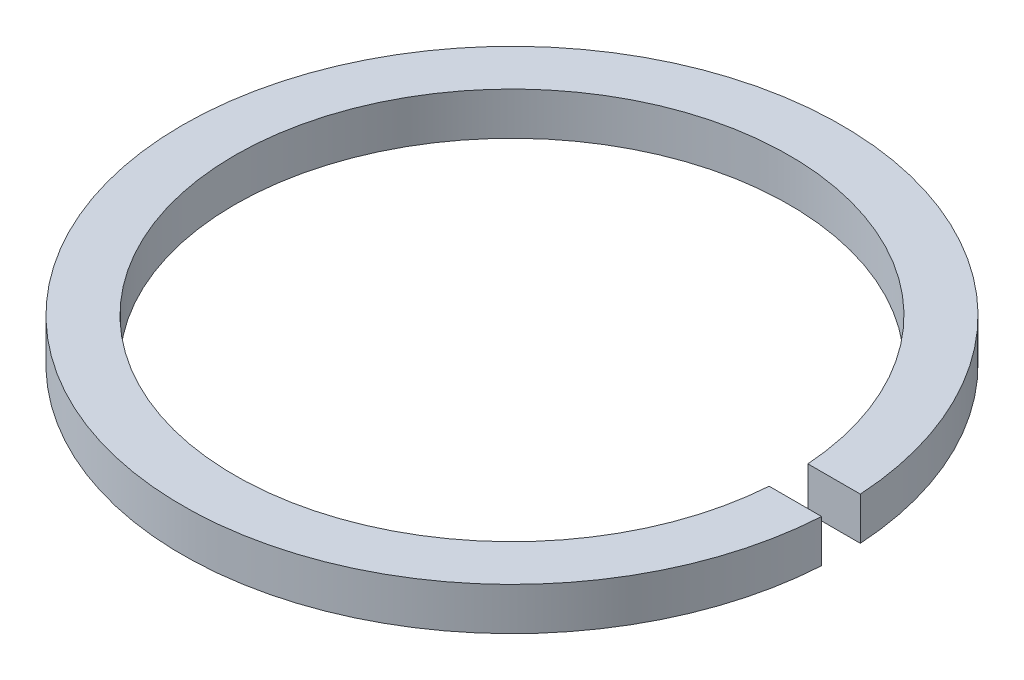
ISO-10303-21;
HEADER;
FILE_DESCRIPTION(('STEP AP214'),'2;1');
FILE_NAME('part.step','',(''),(''),'','','');
FILE_SCHEMA(('AUTOMOTIVE_DESIGN { 1 0 10303 214 1 1 1 1 }'));
ENDSEC;
DATA;
#1=APPLICATION_CONTEXT('core data for automotive mechanical design processes');
#2=APPLICATION_PROTOCOL_DEFINITION('international standard','automotive_design',2000,#1);
#3=PRODUCT_CONTEXT('',#1,'mechanical');
#4=PRODUCT('Part','Part','',(#3));
#5=PRODUCT_RELATED_PRODUCT_CATEGORY('part','',(#4));
#6=PRODUCT_DEFINITION_FORMATION('','',#4);
#7=PRODUCT_DEFINITION_CONTEXT('part definition',#1,'design');
#8=PRODUCT_DEFINITION('design','',#6,#7);
#9=PRODUCT_DEFINITION_SHAPE('','',#8);
#10=(LENGTH_UNIT() NAMED_UNIT(*) SI_UNIT(.MILLI.,.METRE.));
#11=(NAMED_UNIT(*) PLANE_ANGLE_UNIT() SI_UNIT($,.RADIAN.));
#12=(NAMED_UNIT(*) SI_UNIT($,.STERADIAN.) SOLID_ANGLE_UNIT());
#13=UNCERTAINTY_MEASURE_WITH_UNIT(LENGTH_MEASURE(1.E-05),#10,'distance_accuracy_value','');
#14=(GEOMETRIC_REPRESENTATION_CONTEXT(3) GLOBAL_UNCERTAINTY_ASSIGNED_CONTEXT((#13)) GLOBAL_UNIT_ASSIGNED_CONTEXT((#10,
#11,#12)) REPRESENTATION_CONTEXT('',''));
#15=CARTESIAN_POINT('',(0.,0.,0.));
#16=DIRECTION('',(0.,0.,1.));
#17=DIRECTION('',(1.,0.,0.));
#18=AXIS2_PLACEMENT_3D('',#15,#16,#17);
#19=CARTESIAN_POINT('',(10.,1.1,-1.5));
#20=DIRECTION('',(0.,-1.,0.));
#21=DIRECTION('',(0.,0.,-1.));
#22=AXIS2_PLACEMENT_3D('',#19,#20,#21);
#23=PLANE('',#22);
#24=CARTESIAN_POINT('',(0.,1.1,0.));
#25=DIRECTION('',(0.,1.,0.));
#26=DIRECTION('',(0.,0.,1.));
#27=AXIS2_PLACEMENT_3D('',#24,#25,#26);
#28=CIRCLE('',#27,8.5);
#29=CARTESIAN_POINT('',(8.48528137423857,1.1,-0.5));
#30=VERTEX_POINT('',#29);
#31=CARTESIAN_POINT('',(8.48528137423857,1.1,0.5));
#32=VERTEX_POINT('',#31);
#33=EDGE_CURVE('E54',#30,#32,#28,.T.);
#34=ORIENTED_EDGE('',*,*,#33,.T.);
#35=DIRECTION('',(-1.,0.,0.));
#36=VECTOR('',#35,1.);
#37=CARTESIAN_POINT('',(7.13249605678125,1.1,0.5));
#38=LINE('',#37,#36);
#39=CARTESIAN_POINT('',(7.13249605678125,1.1,0.5));
#40=VERTEX_POINT('',#39);
#41=EDGE_CURVE('E101',#32,#40,#38,.T.);
#42=ORIENTED_EDGE('',*,*,#41,.T.);
#43=CARTESIAN_POINT('',(0.,1.1,0.));
#44=DIRECTION('',(0.,-1.,0.));
#45=DIRECTION('',(0.,0.,1.));
#46=AXIS2_PLACEMENT_3D('',#43,#44,#45);
#47=CIRCLE('',#46,7.15);
#48=CARTESIAN_POINT('',(7.13249605678125,1.1,-0.500000000000001));
#49=VERTEX_POINT('',#48);
#50=EDGE_CURVE('E63',#40,#49,#47,.T.);
#51=ORIENTED_EDGE('',*,*,#50,.T.);
#52=DIRECTION('',(1.,0.,0.));
#53=VECTOR('',#52,1.);
#54=CARTESIAN_POINT('',(7.13249605678125,1.1,-0.5));
#55=LINE('',#54,#53);
#56=EDGE_CURVE('E93',#49,#30,#55,.T.);
#57=ORIENTED_EDGE('',*,*,#56,.T.);
#58=EDGE_LOOP('',(#34,#42,#51,#57));
#59=FACE_BOUND('',#58,.T.);
#60=ADVANCED_FACE('F39',(#59),#23,.F.);
#61=CARTESIAN_POINT('',(10.,0.,-1.5));
#62=DIRECTION('',(0.,-1.,0.));
#63=DIRECTION('',(0.,0.,-1.));
#64=AXIS2_PLACEMENT_3D('',#61,#62,#63);
#65=PLANE('',#64);
#66=DIRECTION('',(-1.,0.,0.));
#67=VECTOR('',#66,1.);
#68=CARTESIAN_POINT('',(7.13249605678125,0.,0.5));
#69=LINE('',#68,#67);
#70=CARTESIAN_POINT('',(8.48528137423857,0.,0.5));
#71=VERTEX_POINT('',#70);
#72=CARTESIAN_POINT('',(7.13249605678125,0.,0.5));
#73=VERTEX_POINT('',#72);
#74=EDGE_CURVE('E87',#71,#73,#69,.T.);
#75=ORIENTED_EDGE('',*,*,#74,.F.);
#76=CARTESIAN_POINT('',(0.,0.,0.));
#77=DIRECTION('',(0.,-1.,0.));
#78=DIRECTION('',(0.,0.,-1.));
#79=AXIS2_PLACEMENT_3D('',#76,#77,#78);
#80=CIRCLE('',#79,8.5);
#81=CARTESIAN_POINT('',(8.48528137423857,0.,-0.5));
#82=VERTEX_POINT('',#81);
#83=EDGE_CURVE('E99',#71,#82,#80,.T.);
#84=ORIENTED_EDGE('',*,*,#83,.T.);
#85=DIRECTION('',(1.,0.,0.));
#86=VECTOR('',#85,1.);
#87=CARTESIAN_POINT('',(7.13249605678125,0.,-0.5));
#88=LINE('',#87,#86);
#89=CARTESIAN_POINT('',(7.13249605678125,0.,-0.500000000000001));
#90=VERTEX_POINT('',#89);
#91=EDGE_CURVE('E86',#90,#82,#88,.T.);
#92=ORIENTED_EDGE('',*,*,#91,.F.);
#93=CARTESIAN_POINT('',(0.,0.,0.));
#94=DIRECTION('',(0.,-1.,0.));
#95=DIRECTION('',(0.,0.,1.));
#96=AXIS2_PLACEMENT_3D('',#93,#94,#95);
#97=CIRCLE('',#96,7.15);
#98=EDGE_CURVE('E76',#73,#90,#97,.T.);
#99=ORIENTED_EDGE('',*,*,#98,.F.);
#100=EDGE_LOOP('',(#75,#84,#92,#99));
#101=FACE_BOUND('',#100,.T.);
#102=ADVANCED_FACE('F97',(#101),#65,.T.);
#103=CARTESIAN_POINT('',(7.13249605678125,1.1,0.5));
#104=DIRECTION('',(0.,0.,1.));
#105=DIRECTION('',(1.,0.,0.));
#106=AXIS2_PLACEMENT_3D('',#103,#104,#105);
#107=PLANE('',#106);
#108=DIRECTION('',(0.,1.,0.));
#109=VECTOR('',#108,1.);
#110=CARTESIAN_POINT('',(8.48528137423857,-8.9,0.5));
#111=LINE('',#110,#109);
#112=EDGE_CURVE('E113',#71,#32,#111,.T.);
#113=ORIENTED_EDGE('',*,*,#112,.F.);
#114=ORIENTED_EDGE('',*,*,#74,.T.);
#115=DIRECTION('',(0.,-1.,0.));
#116=VECTOR('',#115,1.);
#117=CARTESIAN_POINT('',(7.13249605678125,1.1,0.5));
#118=LINE('',#117,#116);
#119=EDGE_CURVE('E48',#40,#73,#118,.T.);
#120=ORIENTED_EDGE('',*,*,#119,.F.);
#121=ORIENTED_EDGE('',*,*,#41,.F.);
#122=EDGE_LOOP('',(#113,#114,#120,#121));
#123=FACE_BOUND('',#122,.T.);
#124=ADVANCED_FACE('F41',(#123),#107,.F.);
#125=CARTESIAN_POINT('',(7.13249605678125,1.1,-0.5));
#126=DIRECTION('',(0.,0.,-1.));
#127=DIRECTION('',(-1.,0.,0.));
#128=AXIS2_PLACEMENT_3D('',#125,#126,#127);
#129=PLANE('',#128);
#130=DIRECTION('',(0.,1.,0.));
#131=VECTOR('',#130,1.);
#132=CARTESIAN_POINT('',(8.48528137423857,-8.9,-0.5));
#133=LINE('',#132,#131);
#134=EDGE_CURVE('E12',#30,#82,#133,.F.);
#135=ORIENTED_EDGE('',*,*,#134,.F.);
#136=ORIENTED_EDGE('',*,*,#56,.F.);
#137=DIRECTION('',(0.,-1.,0.));
#138=VECTOR('',#137,1.);
#139=CARTESIAN_POINT('',(7.13249605678125,1.1,-0.500000000000001));
#140=LINE('',#139,#138);
#141=EDGE_CURVE('E79',#49,#90,#140,.T.);
#142=ORIENTED_EDGE('',*,*,#141,.T.);
#143=ORIENTED_EDGE('',*,*,#91,.T.);
#144=EDGE_LOOP('',(#135,#136,#142,#143));
#145=FACE_BOUND('',#144,.T.);
#146=ADVANCED_FACE('F91',(#145),#129,.F.);
#147=CARTESIAN_POINT('',(0.,1.1,0.));
#148=DIRECTION('',(0.,-1.,0.));
#149=DIRECTION('',(0.,0.,-1.));
#150=AXIS2_PLACEMENT_3D('',#147,#148,#149);
#151=CYLINDRICAL_SURFACE('',#150,7.15);
#152=ORIENTED_EDGE('',*,*,#98,.T.);
#153=ORIENTED_EDGE('',*,*,#141,.F.);
#154=ORIENTED_EDGE('',*,*,#50,.F.);
#155=ORIENTED_EDGE('',*,*,#119,.T.);
#156=EDGE_LOOP('',(#152,#153,#154,#155));
#157=FACE_BOUND('',#156,.T.);
#158=ADVANCED_FACE('F78',(#157),#151,.F.);
#159=CARTESIAN_POINT('',(0.,-8.9,0.));
#160=DIRECTION('',(0.,1.,0.));
#161=DIRECTION('',(0.,0.,1.));
#162=AXIS2_PLACEMENT_3D('',#159,#160,#161);
#163=CYLINDRICAL_SURFACE('',#162,8.5);
#164=ORIENTED_EDGE('',*,*,#112,.T.);
#165=ORIENTED_EDGE('',*,*,#33,.F.);
#166=ORIENTED_EDGE('',*,*,#134,.T.);
#167=ORIENTED_EDGE('',*,*,#83,.F.);
#168=EDGE_LOOP('',(#164,#165,#166,#167));
#169=FACE_BOUND('',#168,.T.);
#170=ADVANCED_FACE('F125',(#169),#163,.T.);
#171=CLOSED_SHELL('',(#60,#102,#124,#146,#158,#170));
#172=MANIFOLD_SOLID_BREP('B2',#171);
#173=ADVANCED_BREP_SHAPE_REPRESENTATION('',(#18,#172),#14);
#174=SHAPE_DEFINITION_REPRESENTATION(#9,#173);
ENDSEC;
END-ISO-10303-21;
